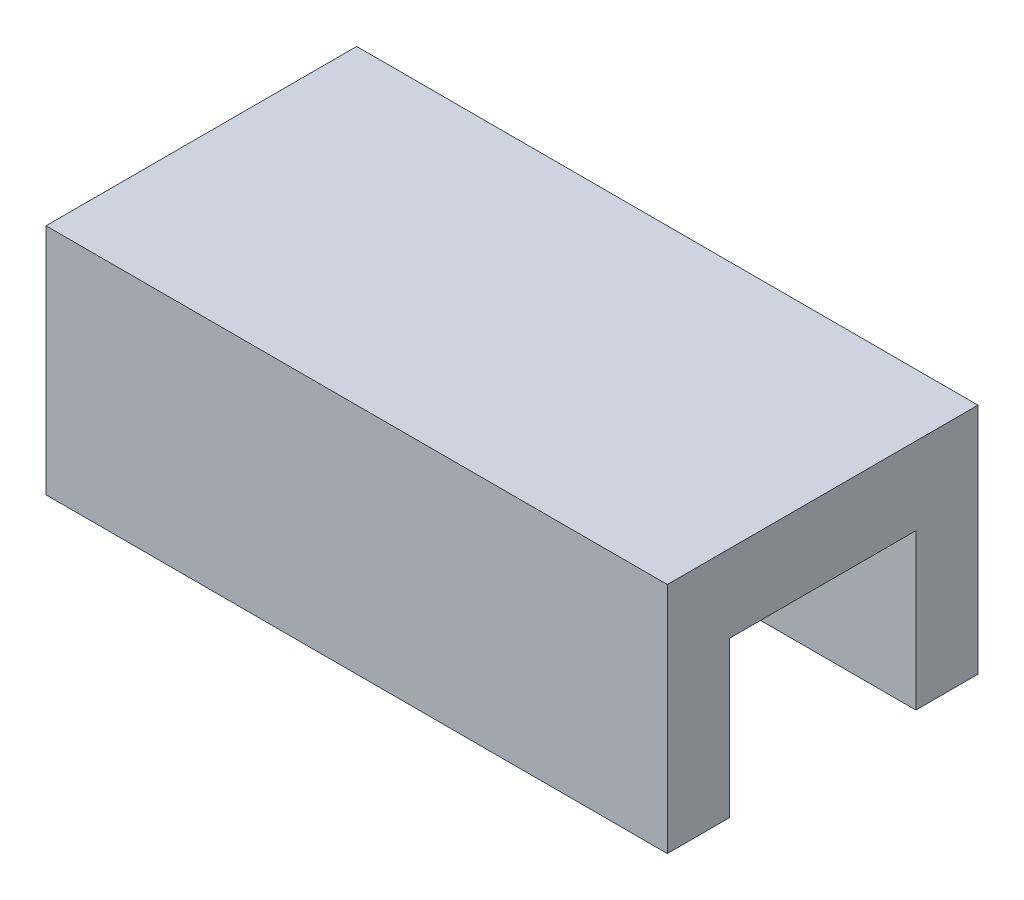
ISO-10303-21;
HEADER;
FILE_DESCRIPTION(('STEP AP214'),'2;1');
FILE_NAME('part.step','',(''),(''),'','','');
FILE_SCHEMA(('AUTOMOTIVE_DESIGN { 1 0 10303 214 1 1 1 1 }'));
ENDSEC;
DATA;
#1=APPLICATION_CONTEXT('core data for automotive mechanical design processes');
#2=APPLICATION_PROTOCOL_DEFINITION('international standard','automotive_design',2000,#1);
#3=PRODUCT_CONTEXT('',#1,'mechanical');
#4=PRODUCT('Part','Part','',(#3));
#5=PRODUCT_RELATED_PRODUCT_CATEGORY('part','',(#4));
#6=PRODUCT_DEFINITION_FORMATION('','',#4);
#7=PRODUCT_DEFINITION_CONTEXT('part definition',#1,'design');
#8=PRODUCT_DEFINITION('design','',#6,#7);
#9=PRODUCT_DEFINITION_SHAPE('','',#8);
#10=(LENGTH_UNIT() NAMED_UNIT(*) SI_UNIT(.MILLI.,.METRE.));
#11=(NAMED_UNIT(*) PLANE_ANGLE_UNIT() SI_UNIT($,.RADIAN.));
#12=(NAMED_UNIT(*) SI_UNIT($,.STERADIAN.) SOLID_ANGLE_UNIT());
#13=UNCERTAINTY_MEASURE_WITH_UNIT(LENGTH_MEASURE(1.E-05),#10,'distance_accuracy_value','');
#14=(GEOMETRIC_REPRESENTATION_CONTEXT(3) GLOBAL_UNCERTAINTY_ASSIGNED_CONTEXT((#13)) GLOBAL_UNIT_ASSIGNED_CONTEXT((#10,
#11,#12)) REPRESENTATION_CONTEXT('',''));
#15=CARTESIAN_POINT('',(0.,0.,0.));
#16=DIRECTION('',(0.,0.,1.));
#17=DIRECTION('',(1.,0.,0.));
#18=AXIS2_PLACEMENT_3D('',#15,#16,#17);
#19=CARTESIAN_POINT('',(40.,0.,0.));
#20=DIRECTION('',(0.,0.,-1.));
#21=DIRECTION('',(0.,1.,0.));
#22=AXIS2_PLACEMENT_3D('',#19,#20,#21);
#23=PLANE('',#22);
#24=DIRECTION('',(0.,-1.,0.));
#25=VECTOR('',#24,1.);
#26=CARTESIAN_POINT('',(0.,0.,0.));
#27=LINE('',#26,#25);
#28=CARTESIAN_POINT('',(0.,15.,0.));
#29=VERTEX_POINT('',#28);
#30=CARTESIAN_POINT('',(0.,0.,0.));
#31=VERTEX_POINT('',#30);
#32=EDGE_CURVE('E144',#29,#31,#27,.T.);
#33=ORIENTED_EDGE('',*,*,#32,.T.);
#34=DIRECTION('',(-1.,0.,0.));
#35=VECTOR('',#34,1.);
#36=CARTESIAN_POINT('',(40.,0.,0.));
#37=LINE('',#36,#35);
#38=CARTESIAN_POINT('',(40.,0.,0.));
#39=VERTEX_POINT('',#38);
#40=EDGE_CURVE('E11',#39,#31,#37,.T.);
#41=ORIENTED_EDGE('',*,*,#40,.F.);
#42=DIRECTION('',(0.,-1.,0.));
#43=VECTOR('',#42,1.);
#44=CARTESIAN_POINT('',(40.,0.,0.));
#45=LINE('',#44,#43);
#46=CARTESIAN_POINT('',(40.,15.,0.));
#47=VERTEX_POINT('',#46);
#48=EDGE_CURVE('E166',#47,#39,#45,.T.);
#49=ORIENTED_EDGE('',*,*,#48,.F.);
#50=DIRECTION('',(-1.,0.,0.));
#51=VECTOR('',#50,1.);
#52=CARTESIAN_POINT('',(40.,15.,0.));
#53=LINE('',#52,#51);
#54=EDGE_CURVE('E140',#47,#29,#53,.T.);
#55=ORIENTED_EDGE('',*,*,#54,.T.);
#56=EDGE_LOOP('',(#33,#41,#49,#55));
#57=FACE_BOUND('',#56,.T.);
#58=ADVANCED_FACE('F43',(#57),#23,.F.);
#59=CARTESIAN_POINT('',(40.,0.,0.));
#60=DIRECTION('',(0.,1.,0.));
#61=DIRECTION('',(0.,0.,1.));
#62=AXIS2_PLACEMENT_3D('',#59,#60,#61);
#63=PLANE('',#62);
#64=DIRECTION('',(0.,0.,-1.));
#65=VECTOR('',#64,1.);
#66=CARTESIAN_POINT('',(0.,0.,0.));
#67=LINE('',#66,#65);
#68=CARTESIAN_POINT('',(0.,0.,-4.));
#69=VERTEX_POINT('',#68);
#70=EDGE_CURVE('E148',#31,#69,#67,.T.);
#71=ORIENTED_EDGE('',*,*,#70,.T.);
#72=DIRECTION('',(-1.,0.,0.));
#73=VECTOR('',#72,1.);
#74=CARTESIAN_POINT('',(40.,0.,-4.));
#75=LINE('',#74,#73);
#76=CARTESIAN_POINT('',(40.,0.,-4.));
#77=VERTEX_POINT('',#76);
#78=EDGE_CURVE('E52',#77,#69,#75,.T.);
#79=ORIENTED_EDGE('',*,*,#78,.F.);
#80=DIRECTION('',(0.,0.,-1.));
#81=VECTOR('',#80,1.);
#82=CARTESIAN_POINT('',(40.,0.,0.));
#83=LINE('',#82,#81);
#84=EDGE_CURVE('E103',#39,#77,#83,.T.);
#85=ORIENTED_EDGE('',*,*,#84,.F.);
#86=ORIENTED_EDGE('',*,*,#40,.T.);
#87=EDGE_LOOP('',(#71,#79,#85,#86));
#88=FACE_BOUND('',#87,.T.);
#89=ADVANCED_FACE('F212',(#88),#63,.F.);
#90=CARTESIAN_POINT('',(40.,0.,-4.));
#91=DIRECTION('',(0.,0.,1.));
#92=DIRECTION('',(1.,0.,0.));
#93=AXIS2_PLACEMENT_3D('',#90,#91,#92);
#94=PLANE('',#93);
#95=DIRECTION('',(0.,1.,0.));
#96=VECTOR('',#95,1.);
#97=CARTESIAN_POINT('',(0.,0.,-4.));
#98=LINE('',#97,#96);
#99=CARTESIAN_POINT('',(0.,10.,-4.));
#100=VERTEX_POINT('',#99);
#101=EDGE_CURVE('E151',#69,#100,#98,.T.);
#102=ORIENTED_EDGE('',*,*,#101,.T.);
#103=DIRECTION('',(-1.,0.,0.));
#104=VECTOR('',#103,1.);
#105=CARTESIAN_POINT('',(40.,10.,-4.));
#106=LINE('',#105,#104);
#107=CARTESIAN_POINT('',(40.,10.,-4.));
#108=VERTEX_POINT('',#107);
#109=EDGE_CURVE('E177',#108,#100,#106,.T.);
#110=ORIENTED_EDGE('',*,*,#109,.F.);
#111=DIRECTION('',(0.,1.,0.));
#112=VECTOR('',#111,1.);
#113=CARTESIAN_POINT('',(40.,0.,-4.));
#114=LINE('',#113,#112);
#115=EDGE_CURVE('E187',#77,#108,#114,.T.);
#116=ORIENTED_EDGE('',*,*,#115,.F.);
#117=ORIENTED_EDGE('',*,*,#78,.T.);
#118=EDGE_LOOP('',(#102,#110,#116,#117));
#119=FACE_BOUND('',#118,.T.);
#120=ADVANCED_FACE('F185',(#119),#94,.F.);
#121=CARTESIAN_POINT('',(40.,10.,-4.));
#122=DIRECTION('',(0.,1.,0.));
#123=DIRECTION('',(0.,0.,1.));
#124=AXIS2_PLACEMENT_3D('',#121,#122,#123);
#125=PLANE('',#124);
#126=DIRECTION('',(0.,0.,-1.));
#127=VECTOR('',#126,1.);
#128=CARTESIAN_POINT('',(0.,10.,-4.));
#129=LINE('',#128,#127);
#130=CARTESIAN_POINT('',(0.,10.,-16.));
#131=VERTEX_POINT('',#130);
#132=EDGE_CURVE('E154',#100,#131,#129,.T.);
#133=ORIENTED_EDGE('',*,*,#132,.T.);
#134=DIRECTION('',(-1.,0.,0.));
#135=VECTOR('',#134,1.);
#136=CARTESIAN_POINT('',(40.,10.,-16.));
#137=LINE('',#136,#135);
#138=CARTESIAN_POINT('',(40.,10.,-16.));
#139=VERTEX_POINT('',#138);
#140=EDGE_CURVE('E173',#139,#131,#137,.T.);
#141=ORIENTED_EDGE('',*,*,#140,.F.);
#142=DIRECTION('',(0.,0.,-1.));
#143=VECTOR('',#142,1.);
#144=CARTESIAN_POINT('',(40.,10.,-4.));
#145=LINE('',#144,#143);
#146=EDGE_CURVE('E200',#108,#139,#145,.T.);
#147=ORIENTED_EDGE('',*,*,#146,.F.);
#148=ORIENTED_EDGE('',*,*,#109,.T.);
#149=EDGE_LOOP('',(#133,#141,#147,#148));
#150=FACE_BOUND('',#149,.T.);
#151=ADVANCED_FACE('F195',(#150),#125,.F.);
#152=CARTESIAN_POINT('',(40.,10.,-16.));
#153=DIRECTION('',(0.,0.,-1.));
#154=DIRECTION('',(-1.,0.,0.));
#155=AXIS2_PLACEMENT_3D('',#152,#153,#154);
#156=PLANE('',#155);
#157=DIRECTION('',(0.,-1.,0.));
#158=VECTOR('',#157,1.);
#159=CARTESIAN_POINT('',(0.,10.,-16.));
#160=LINE('',#159,#158);
#161=CARTESIAN_POINT('',(0.,0.,-16.));
#162=VERTEX_POINT('',#161);
#163=EDGE_CURVE('E157',#131,#162,#160,.T.);
#164=ORIENTED_EDGE('',*,*,#163,.T.);
#165=DIRECTION('',(-1.,0.,0.));
#166=VECTOR('',#165,1.);
#167=CARTESIAN_POINT('',(40.,0.,-16.));
#168=LINE('',#167,#166);
#169=CARTESIAN_POINT('',(40.,0.,-16.));
#170=VERTEX_POINT('',#169);
#171=EDGE_CURVE('E133',#170,#162,#168,.T.);
#172=ORIENTED_EDGE('',*,*,#171,.F.);
#173=DIRECTION('',(0.,-1.,0.));
#174=VECTOR('',#173,1.);
#175=CARTESIAN_POINT('',(40.,10.,-16.));
#176=LINE('',#175,#174);
#177=EDGE_CURVE('E122',#139,#170,#176,.T.);
#178=ORIENTED_EDGE('',*,*,#177,.F.);
#179=ORIENTED_EDGE('',*,*,#140,.T.);
#180=EDGE_LOOP('',(#164,#172,#178,#179));
#181=FACE_BOUND('',#180,.T.);
#182=ADVANCED_FACE('F198',(#181),#156,.F.);
#183=CARTESIAN_POINT('',(40.,0.,-16.));
#184=DIRECTION('',(0.,1.,0.));
#185=DIRECTION('',(0.,0.,1.));
#186=AXIS2_PLACEMENT_3D('',#183,#184,#185);
#187=PLANE('',#186);
#188=DIRECTION('',(0.,0.,-1.));
#189=VECTOR('',#188,1.);
#190=CARTESIAN_POINT('',(0.,0.,-16.));
#191=LINE('',#190,#189);
#192=CARTESIAN_POINT('',(0.,0.,-20.));
#193=VERTEX_POINT('',#192);
#194=EDGE_CURVE('E131',#162,#193,#191,.T.);
#195=ORIENTED_EDGE('',*,*,#194,.T.);
#196=DIRECTION('',(-1.,0.,0.));
#197=VECTOR('',#196,1.);
#198=CARTESIAN_POINT('',(40.,0.,-20.));
#199=LINE('',#198,#197);
#200=CARTESIAN_POINT('',(40.,0.,-20.));
#201=VERTEX_POINT('',#200);
#202=EDGE_CURVE('E128',#201,#193,#199,.T.);
#203=ORIENTED_EDGE('',*,*,#202,.F.);
#204=DIRECTION('',(0.,0.,-1.));
#205=VECTOR('',#204,1.);
#206=CARTESIAN_POINT('',(40.,0.,-16.));
#207=LINE('',#206,#205);
#208=EDGE_CURVE('E116',#170,#201,#207,.T.);
#209=ORIENTED_EDGE('',*,*,#208,.F.);
#210=ORIENTED_EDGE('',*,*,#171,.T.);
#211=EDGE_LOOP('',(#195,#203,#209,#210));
#212=FACE_BOUND('',#211,.T.);
#213=ADVANCED_FACE('F129',(#212),#187,.F.);
#214=CARTESIAN_POINT('',(40.,0.,-20.));
#215=DIRECTION('',(0.,0.,1.));
#216=DIRECTION('',(0.,-1.,0.));
#217=AXIS2_PLACEMENT_3D('',#214,#215,#216);
#218=PLANE('',#217);
#219=DIRECTION('',(0.,1.,0.));
#220=VECTOR('',#219,1.);
#221=CARTESIAN_POINT('',(0.,0.,-20.));
#222=LINE('',#221,#220);
#223=CARTESIAN_POINT('',(0.,15.,-20.));
#224=VERTEX_POINT('',#223);
#225=EDGE_CURVE('E89',#193,#224,#222,.T.);
#226=ORIENTED_EDGE('',*,*,#225,.T.);
#227=DIRECTION('',(-1.,0.,0.));
#228=VECTOR('',#227,1.);
#229=CARTESIAN_POINT('',(40.,15.,-20.));
#230=LINE('',#229,#228);
#231=CARTESIAN_POINT('',(40.,15.,-20.));
#232=VERTEX_POINT('',#231);
#233=EDGE_CURVE('E134',#232,#224,#230,.T.);
#234=ORIENTED_EDGE('',*,*,#233,.F.);
#235=DIRECTION('',(0.,1.,0.));
#236=VECTOR('',#235,1.);
#237=CARTESIAN_POINT('',(40.,0.,-20.));
#238=LINE('',#237,#236);
#239=EDGE_CURVE('E120',#201,#232,#238,.T.);
#240=ORIENTED_EDGE('',*,*,#239,.F.);
#241=ORIENTED_EDGE('',*,*,#202,.T.);
#242=EDGE_LOOP('',(#226,#234,#240,#241));
#243=FACE_BOUND('',#242,.T.);
#244=ADVANCED_FACE('F136',(#243),#218,.F.);
#245=CARTESIAN_POINT('',(40.,15.,0.));
#246=DIRECTION('',(0.,-1.,0.));
#247=DIRECTION('',(0.,0.,-1.));
#248=AXIS2_PLACEMENT_3D('',#245,#246,#247);
#249=PLANE('',#248);
#250=DIRECTION('',(0.,0.,1.));
#251=VECTOR('',#250,1.);
#252=CARTESIAN_POINT('',(0.,15.,0.));
#253=LINE('',#252,#251);
#254=EDGE_CURVE('E95',#224,#29,#253,.T.);
#255=ORIENTED_EDGE('',*,*,#254,.T.);
#256=ORIENTED_EDGE('',*,*,#54,.F.);
#257=DIRECTION('',(0.,0.,1.));
#258=VECTOR('',#257,1.);
#259=CARTESIAN_POINT('',(40.,15.,0.));
#260=LINE('',#259,#258);
#261=EDGE_CURVE('E60',#232,#47,#260,.T.);
#262=ORIENTED_EDGE('',*,*,#261,.F.);
#263=ORIENTED_EDGE('',*,*,#233,.T.);
#264=EDGE_LOOP('',(#255,#256,#262,#263));
#265=FACE_BOUND('',#264,.T.);
#266=ADVANCED_FACE('F228',(#265),#249,.F.);
#267=CARTESIAN_POINT('',(40.,0.,0.));
#268=DIRECTION('',(-1.,0.,0.));
#269=DIRECTION('',(0.,0.,1.));
#270=AXIS2_PLACEMENT_3D('',#267,#268,#269);
#271=PLANE('',#270);
#272=ORIENTED_EDGE('',*,*,#48,.T.);
#273=ORIENTED_EDGE('',*,*,#84,.T.);
#274=ORIENTED_EDGE('',*,*,#115,.T.);
#275=ORIENTED_EDGE('',*,*,#146,.T.);
#276=ORIENTED_EDGE('',*,*,#177,.T.);
#277=ORIENTED_EDGE('',*,*,#208,.T.);
#278=ORIENTED_EDGE('',*,*,#239,.T.);
#279=ORIENTED_EDGE('',*,*,#261,.T.);
#280=EDGE_LOOP('',(#272,#273,#274,#275,#276,#277,#278,#279));
#281=FACE_BOUND('',#280,.T.);
#282=ADVANCED_FACE('F118',(#281),#271,.F.);
#283=CARTESIAN_POINT('',(0.,0.,0.));
#284=DIRECTION('',(-1.,0.,0.));
#285=DIRECTION('',(0.,0.,1.));
#286=AXIS2_PLACEMENT_3D('',#283,#284,#285);
#287=PLANE('',#286);
#288=ORIENTED_EDGE('',*,*,#32,.F.);
#289=ORIENTED_EDGE('',*,*,#254,.F.);
#290=ORIENTED_EDGE('',*,*,#225,.F.);
#291=ORIENTED_EDGE('',*,*,#194,.F.);
#292=ORIENTED_EDGE('',*,*,#163,.F.);
#293=ORIENTED_EDGE('',*,*,#132,.F.);
#294=ORIENTED_EDGE('',*,*,#101,.F.);
#295=ORIENTED_EDGE('',*,*,#70,.F.);
#296=EDGE_LOOP('',(#288,#289,#290,#291,#292,#293,#294,#295));
#297=FACE_BOUND('',#296,.T.);
#298=ADVANCED_FACE('F191',(#297),#287,.T.);
#299=CLOSED_SHELL('',(#58,#89,#120,#151,#182,#213,#244,#266,#282,#298));
#300=MANIFOLD_SOLID_BREP('B2',#299);
#301=ADVANCED_BREP_SHAPE_REPRESENTATION('',(#18,#300),#14);
#302=SHAPE_DEFINITION_REPRESENTATION(#9,#301);
ENDSEC;
END-ISO-10303-21;
